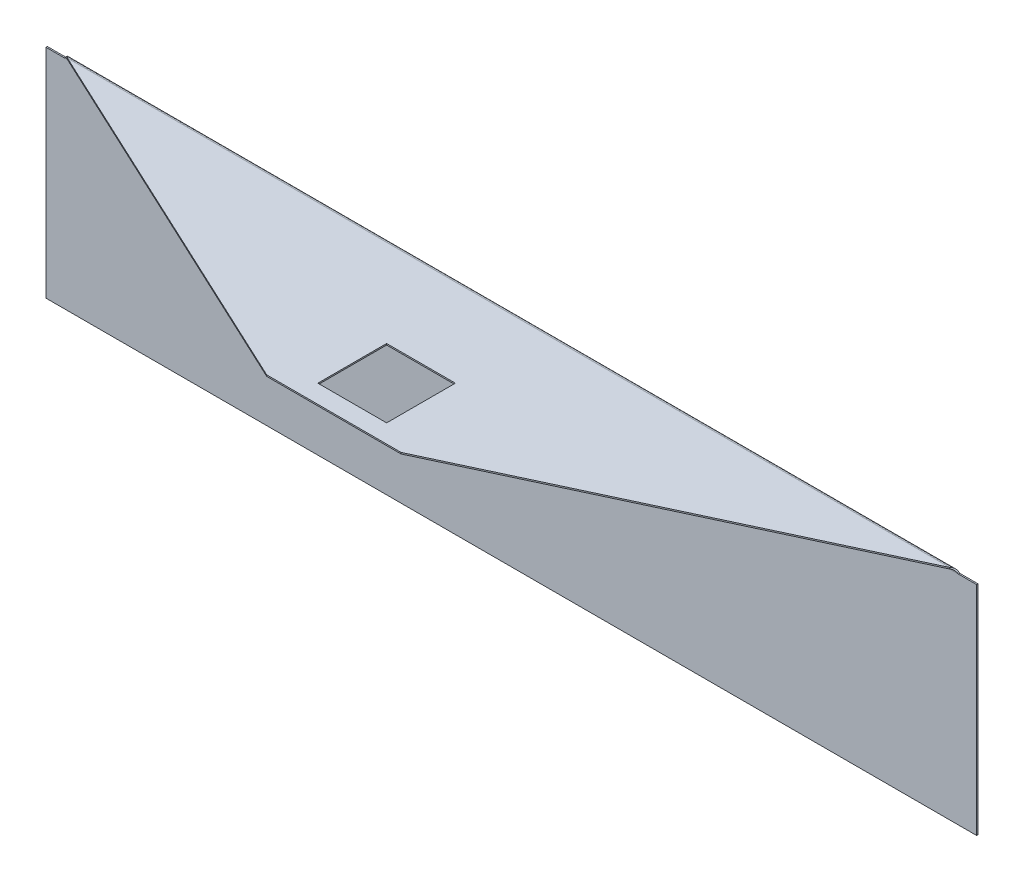
ISO-10303-21;
HEADER;
FILE_DESCRIPTION(('STEP AP214'),'2;1');
FILE_NAME('part.step','',(''),(''),'','','');
FILE_SCHEMA(('AUTOMOTIVE_DESIGN { 1 0 10303 214 1 1 1 1 }'));
ENDSEC;
DATA;
#1=APPLICATION_CONTEXT('core data for automotive mechanical design processes');
#2=APPLICATION_PROTOCOL_DEFINITION('international standard','automotive_design',2000,#1);
#3=PRODUCT_CONTEXT('',#1,'mechanical');
#4=PRODUCT('Part','Part','',(#3));
#5=PRODUCT_RELATED_PRODUCT_CATEGORY('part','',(#4));
#6=PRODUCT_DEFINITION_FORMATION('','',#4);
#7=PRODUCT_DEFINITION_CONTEXT('part definition',#1,'design');
#8=PRODUCT_DEFINITION('design','',#6,#7);
#9=PRODUCT_DEFINITION_SHAPE('','',#8);
#10=(LENGTH_UNIT() NAMED_UNIT(*) SI_UNIT(.MILLI.,.METRE.));
#11=(NAMED_UNIT(*) PLANE_ANGLE_UNIT() SI_UNIT($,.RADIAN.));
#12=(NAMED_UNIT(*) SI_UNIT($,.STERADIAN.) SOLID_ANGLE_UNIT());
#13=UNCERTAINTY_MEASURE_WITH_UNIT(LENGTH_MEASURE(1.E-05),#10,'distance_accuracy_value','');
#14=(GEOMETRIC_REPRESENTATION_CONTEXT(3) GLOBAL_UNCERTAINTY_ASSIGNED_CONTEXT((#13)) GLOBAL_UNIT_ASSIGNED_CONTEXT((#10,
#11,#12)) REPRESENTATION_CONTEXT('',''));
#15=CARTESIAN_POINT('',(0.,0.,0.));
#16=DIRECTION('',(0.,0.,1.));
#17=DIRECTION('',(1.,0.,0.));
#18=AXIS2_PLACEMENT_3D('',#15,#16,#17);
#19=CARTESIAN_POINT('',(507.5,241.5,0.));
#20=DIRECTION('',(0.,-1.,0.));
#21=DIRECTION('',(0.,0.,-1.));
#22=AXIS2_PLACEMENT_3D('',#19,#20,#21);
#23=PLANE('',#22);
#24=DIRECTION('',(-1.,0.,0.));
#25=VECTOR('',#24,1.);
#26=CARTESIAN_POINT('',(37.5,241.5,98.5));
#27=LINE('',#26,#25);
#28=CARTESIAN_POINT('',(37.5,241.5,98.5));
#29=VERTEX_POINT('',#28);
#30=CARTESIAN_POINT('',(-37.5,241.5,98.5));
#31=VERTEX_POINT('',#30);
#32=EDGE_CURVE('E160',#29,#31,#27,.T.);
#33=ORIENTED_EDGE('',*,*,#32,.F.);
#34=DIRECTION('',(0.,0.,-1.));
#35=VECTOR('',#34,1.);
#36=CARTESIAN_POINT('',(37.5,241.5,173.5));
#37=LINE('',#36,#35);
#38=CARTESIAN_POINT('',(37.5,241.5,173.5));
#39=VERTEX_POINT('',#38);
#40=EDGE_CURVE('E143',#39,#29,#37,.T.);
#41=ORIENTED_EDGE('',*,*,#40,.F.);
#42=DIRECTION('',(1.,0.,0.));
#43=VECTOR('',#42,1.);
#44=CARTESIAN_POINT('',(37.5,241.5,173.5));
#45=LINE('',#44,#43);
#46=CARTESIAN_POINT('',(-37.5,241.5,173.5));
#47=VERTEX_POINT('',#46);
#48=EDGE_CURVE('E152',#47,#39,#45,.T.);
#49=ORIENTED_EDGE('',*,*,#48,.F.);
#50=DIRECTION('',(0.,0.,1.));
#51=VECTOR('',#50,1.);
#52=CARTESIAN_POINT('',(-37.5,241.5,173.5));
#53=LINE('',#52,#51);
#54=EDGE_CURVE('E55',#31,#47,#53,.T.);
#55=ORIENTED_EDGE('',*,*,#54,.F.);
#56=EDGE_LOOP('',(#33,#41,#49,#55));
#57=FACE_BOUND('',#56,.T.);
#58=DIRECTION('',(-0.906034195359543,0.,-0.423204485844829));
#59=VECTOR('',#58,1.);
#60=CARTESIAN_POINT('',(-503.923943507499,241.5,-7.65594310815242));
#61=LINE('',#60,#59);
#62=CARTESIAN_POINT('',(-73.2712232463776,241.5,193.5));
#63=VERTEX_POINT('',#62);
#64=CARTESIAN_POINT('',(-481.110742885302,241.5,3.));
#65=VERTEX_POINT('',#64);
#66=EDGE_CURVE('E183',#63,#65,#61,.T.);
#67=ORIENTED_EDGE('',*,*,#66,.F.);
#68=DIRECTION('',(-1.,0.,0.));
#69=VECTOR('',#68,1.);
#70=CARTESIAN_POINT('',(507.5,241.5,193.5));
#71=LINE('',#70,#69);
#72=CARTESIAN_POINT('',(73.2712232463776,241.5,193.5));
#73=VERTEX_POINT('',#72);
#74=EDGE_CURVE('E296',#73,#63,#71,.T.);
#75=ORIENTED_EDGE('',*,*,#74,.F.);
#76=DIRECTION('',(0.906034195359543,0.,-0.423204485844829));
#77=VECTOR('',#76,1.);
#78=CARTESIAN_POINT('',(503.923943507499,241.5,-7.65594310815242));
#79=LINE('',#78,#77);
#80=CARTESIAN_POINT('',(481.110742885302,241.5,3.));
#81=VERTEX_POINT('',#80);
#82=EDGE_CURVE('E330',#73,#81,#79,.T.);
#83=ORIENTED_EDGE('',*,*,#82,.T.);
#84=DIRECTION('',(-1.,0.,0.));
#85=VECTOR('',#84,1.);
#86=CARTESIAN_POINT('',(507.5,241.5,3.));
#87=LINE('',#86,#85);
#88=EDGE_CURVE('E267',#81,#65,#87,.T.);
#89=ORIENTED_EDGE('',*,*,#88,.T.);
#90=EDGE_LOOP('',(#67,#75,#83,#89));
#91=FACE_BOUND('',#90,.T.);
#92=ADVANCED_FACE('F40',(#57,#91),#23,.F.);
#93=CARTESIAN_POINT('',(507.5,240.,193.5));
#94=DIRECTION('',(0.,0.,1.));
#95=DIRECTION('',(1.,0.,0.));
#96=AXIS2_PLACEMENT_3D('',#93,#94,#95);
#97=PLANE('',#96);
#98=ORIENTED_EDGE('',*,*,#74,.T.);
#99=DIRECTION('',(0.,-1.,0.));
#100=VECTOR('',#99,1.);
#101=CARTESIAN_POINT('',(-73.2712232463776,241.5,193.5));
#102=LINE('',#101,#100);
#103=CARTESIAN_POINT('',(-73.2712232463776,240.,193.5));
#104=VERTEX_POINT('',#103);
#105=EDGE_CURVE('E155',#104,#63,#102,.F.);
#106=ORIENTED_EDGE('',*,*,#105,.F.);
#107=DIRECTION('',(-1.,0.,0.));
#108=VECTOR('',#107,1.);
#109=CARTESIAN_POINT('',(507.5,240.,193.5));
#110=LINE('',#109,#108);
#111=CARTESIAN_POINT('',(73.2712232463776,240.,193.5));
#112=VERTEX_POINT('',#111);
#113=EDGE_CURVE('E292',#112,#104,#110,.T.);
#114=ORIENTED_EDGE('',*,*,#113,.F.);
#115=DIRECTION('',(0.,-1.,0.));
#116=VECTOR('',#115,1.);
#117=CARTESIAN_POINT('',(73.2712232463776,241.5,193.5));
#118=LINE('',#117,#116);
#119=EDGE_CURVE('E256',#112,#73,#118,.F.);
#120=ORIENTED_EDGE('',*,*,#119,.T.);
#121=EDGE_LOOP('',(#98,#106,#114,#120));
#122=FACE_BOUND('',#121,.T.);
#123=ADVANCED_FACE('F337',(#122),#97,.T.);
#124=CARTESIAN_POINT('',(507.5,240.,0.));
#125=DIRECTION('',(0.,-1.,0.));
#126=DIRECTION('',(0.,0.,-1.));
#127=AXIS2_PLACEMENT_3D('',#124,#125,#126);
#128=PLANE('',#127);
#129=DIRECTION('',(0.,0.,1.));
#130=VECTOR('',#129,1.);
#131=CARTESIAN_POINT('',(37.5,240.,173.5));
#132=LINE('',#131,#130);
#133=CARTESIAN_POINT('',(37.5,240.,98.5));
#134=VERTEX_POINT('',#133);
#135=CARTESIAN_POINT('',(37.5,240.,173.5));
#136=VERTEX_POINT('',#135);
#137=EDGE_CURVE('E63',#134,#136,#132,.T.);
#138=ORIENTED_EDGE('',*,*,#137,.F.);
#139=DIRECTION('',(1.,0.,0.));
#140=VECTOR('',#139,1.);
#141=CARTESIAN_POINT('',(37.5,240.,98.5));
#142=LINE('',#141,#140);
#143=CARTESIAN_POINT('',(-37.5,240.,98.5));
#144=VERTEX_POINT('',#143);
#145=EDGE_CURVE('E149',#144,#134,#142,.T.);
#146=ORIENTED_EDGE('',*,*,#145,.F.);
#147=DIRECTION('',(0.,0.,-1.));
#148=VECTOR('',#147,1.);
#149=CARTESIAN_POINT('',(-37.5,240.,173.5));
#150=LINE('',#149,#148);
#151=CARTESIAN_POINT('',(-37.5,240.,173.5));
#152=VERTEX_POINT('',#151);
#153=EDGE_CURVE('E168',#152,#144,#150,.T.);
#154=ORIENTED_EDGE('',*,*,#153,.F.);
#155=DIRECTION('',(-1.,0.,0.));
#156=VECTOR('',#155,1.);
#157=CARTESIAN_POINT('',(37.5,240.,173.5));
#158=LINE('',#157,#156);
#159=EDGE_CURVE('E162',#136,#152,#158,.T.);
#160=ORIENTED_EDGE('',*,*,#159,.F.);
#161=EDGE_LOOP('',(#138,#146,#154,#160));
#162=FACE_BOUND('',#161,.T.);
#163=ORIENTED_EDGE('',*,*,#113,.T.);
#164=DIRECTION('',(-0.906034195359543,0.,-0.423204485844829));
#165=VECTOR('',#164,1.);
#166=CARTESIAN_POINT('',(-503.923943507499,240.,-7.65594310815242));
#167=LINE('',#166,#165);
#168=CARTESIAN_POINT('',(-481.110742885302,240.,2.99999999999997));
#169=VERTEX_POINT('',#168);
#170=EDGE_CURVE('E178',#104,#169,#167,.T.);
#171=ORIENTED_EDGE('',*,*,#170,.T.);
#172=DIRECTION('',(-1.,0.,0.));
#173=VECTOR('',#172,1.);
#174=CARTESIAN_POINT('',(507.5,240.,3.));
#175=LINE('',#174,#173);
#176=CARTESIAN_POINT('',(481.110742885302,240.,2.99999999999997));
#177=VERTEX_POINT('',#176);
#178=EDGE_CURVE('E289',#177,#169,#175,.T.);
#179=ORIENTED_EDGE('',*,*,#178,.F.);
#180=DIRECTION('',(0.906034195359543,0.,-0.423204485844829));
#181=VECTOR('',#180,1.);
#182=CARTESIAN_POINT('',(503.923943507499,240.,-7.65594310815242));
#183=LINE('',#182,#181);
#184=EDGE_CURVE('E327',#112,#177,#183,.T.);
#185=ORIENTED_EDGE('',*,*,#184,.F.);
#186=EDGE_LOOP('',(#163,#171,#179,#185));
#187=FACE_BOUND('',#186,.T.);
#188=ADVANCED_FACE('F357',(#162,#187),#128,.T.);
#189=CARTESIAN_POINT('',(507.5,237.,3.));
#190=DIRECTION('',(-1.,0.,0.));
#191=DIRECTION('',(0.,0.,1.));
#192=AXIS2_PLACEMENT_3D('',#189,#190,#191);
#193=CYLINDRICAL_SURFACE('',#192,3.);
#194=ORIENTED_EDGE('',*,*,#178,.T.);
#195=CARTESIAN_POINT('',(-487.533412485915,237.,0.));
#196=CARTESIAN_POINT('',(-487.403451332048,237.095349117325,-1.48598657634483E-05));
#197=CARTESIAN_POINT('',(-487.27349213495,237.190698469654,0.00454510566328577));
#198=CARTESIAN_POINT('',(-487.013592538698,237.380523543049,0.0227080038034484));
#199=CARTESIAN_POINT('',(-486.883652139238,237.474999372649,0.0363097972438175));
#200=CARTESIAN_POINT('',(-486.623777821424,237.662223764344,0.0724489467742617));
#201=CARTESIAN_POINT('',(-486.49384390303,237.754972399899,0.0949859219291862));
#202=CARTESIAN_POINT('',(-486.234372549697,237.937615423378,0.148700452649654));
#203=CARTESIAN_POINT('',(-486.10483512781,238.027517731664,0.179851146312812));
#204=CARTESIAN_POINT('',(-485.845765499757,238.203957974717,0.250542388969023));
#205=CARTESIAN_POINT('',(-485.716233293574,238.290496033564,0.290082628191677));
#206=CARTESIAN_POINT('',(-485.457175049675,238.459429926774,0.377196939170626));
#207=CARTESIAN_POINT('',(-485.327649011887,238.541825880059,0.42477078010638));
#208=CARTESIAN_POINT('',(-485.068347121147,238.701888971311,0.527624441817014));
#209=CARTESIAN_POINT('',(-484.93857127189,238.779546608275,0.582919058461141));
#210=CARTESIAN_POINT('',(-484.679008034836,238.929251651493,0.700639966775583));
#211=CARTESIAN_POINT('',(-484.54922064679,239.001298768227,0.763066626072952));
#212=CARTESIAN_POINT('',(-484.289640118908,239.139135242221,0.894490949999997));
#213=CARTESIAN_POINT('',(-484.159846979105,239.204924290311,0.963488938939827));
#214=CARTESIAN_POINT('',(-483.900348936281,239.329603212219,1.10738134409735));
#215=CARTESIAN_POINT('',(-483.77064403243,239.388497680802,1.18227177710861));
#216=CARTESIAN_POINT('',(-483.511245814195,239.49890252681,1.33730882134258));
#217=CARTESIAN_POINT('',(-483.381552499569,239.550413322122,1.41745513472721));
#218=CARTESIAN_POINT('',(-483.122182520375,239.645574506633,1.58225979815205));
#219=CARTESIAN_POINT('',(-482.992505857618,239.689226455846,1.66691724837761));
#220=CARTESIAN_POINT('',(-482.76554905599,239.758417332932,1.81837793251847));
#221=CARTESIAN_POINT('',(-482.668265385925,239.785757318976,1.88436056522504));
#222=CARTESIAN_POINT('',(-482.473708780352,239.835658918839,2.01809814043252));
#223=CARTESIAN_POINT('',(-482.376435845307,239.858221217743,2.0858528272658));
#224=CARTESIAN_POINT('',(-482.181899644516,239.898456300248,2.22279742951416));
#225=CARTESIAN_POINT('',(-482.084636378552,239.916129400171,2.29198725176654));
#226=CARTESIAN_POINT('',(-481.889982958145,239.946517280017,2.43154343283732));
#227=CARTESIAN_POINT('',(-481.792592804402,239.959225533808,2.50191121426224));
#228=CARTESIAN_POINT('',(-481.597802061669,239.979584839993,2.6433775223538));
#229=CARTESIAN_POINT('',(-481.500401472493,239.987235464082,2.71447611039111));
#230=CARTESIAN_POINT('',(-481.305581517872,239.997445789566,2.85704950872596));
#231=CARTESIAN_POINT('',(-481.208162152244,240.000004561375,2.92852438533244));
#232=CARTESIAN_POINT('',(-481.110742885302,240.,2.99999999999998));
#233=B_SPLINE_CURVE_WITH_KNOTS('',3,(#195,#196,#197,#198,#199,#200,#201,#202,#203,#204,#205,
#206,#207,#208,#209,#210,#211,#212,#213,#214,#215,#216,#217,#218,#219,#220,#221,#222,#223,#224,
#225,#226,#227,#228,#229,#230,#231,#232),.UNSPECIFIED.,.F.,.F.,(4,2,2,2,2,2,2,2,2,2,2,2,2,2,2,2,
2,2,4),(0.,0.483495476622525,0.966930049681638,1.45034401460672,1.93226713075571,
2.41417245576878,2.89606393708733,3.37889190997741,3.86174478187414,4.34462149602549,
4.82717455159902,5.30970028564311,5.79213013028426,6.15408935439192,6.51599664089968,
6.87788050705167,7.24023847025828,7.60262711579612,7.96508191422729),.UNSPECIFIED.);
#234=CARTESIAN_POINT('',(-487.533412485915,237.,0.));
#235=VERTEX_POINT('',#234);
#236=EDGE_CURVE('E195',#235,#169,#233,.T.);
#237=ORIENTED_EDGE('',*,*,#236,.F.);
#238=DIRECTION('',(-1.,0.,0.));
#239=VECTOR('',#238,1.);
#240=CARTESIAN_POINT('',(507.5,237.,0.));
#241=LINE('',#240,#239);
#242=CARTESIAN_POINT('',(487.533412485915,237.,0.));
#243=VERTEX_POINT('',#242);
#244=EDGE_CURVE('E286',#243,#235,#241,.T.);
#245=ORIENTED_EDGE('',*,*,#244,.F.);
#246=CARTESIAN_POINT('',(487.533412485915,237.,0.));
#247=CARTESIAN_POINT('',(487.403451332048,237.095349117325,-1.48598657634483E-05));
#248=CARTESIAN_POINT('',(487.27349213495,237.190698469654,0.00454510566328577));
#249=CARTESIAN_POINT('',(487.013592538698,237.380523543049,0.0227080038034484));
#250=CARTESIAN_POINT('',(486.883652139238,237.474999372649,0.0363097972438175));
#251=CARTESIAN_POINT('',(486.623777821424,237.662223764344,0.0724489467742617));
#252=CARTESIAN_POINT('',(486.49384390303,237.754972399899,0.0949859219291862));
#253=CARTESIAN_POINT('',(486.234372549697,237.937615423378,0.148700452649654));
#254=CARTESIAN_POINT('',(486.10483512781,238.027517731664,0.179851146312812));
#255=CARTESIAN_POINT('',(485.845765499757,238.203957974717,0.250542388969023));
#256=CARTESIAN_POINT('',(485.716233293574,238.290496033564,0.290082628191677));
#257=CARTESIAN_POINT('',(485.457175049675,238.459429926774,0.377196939170626));
#258=CARTESIAN_POINT('',(485.327649011887,238.541825880059,0.42477078010638));
#259=CARTESIAN_POINT('',(485.068347121147,238.701888971311,0.527624441817014));
#260=CARTESIAN_POINT('',(484.93857127189,238.779546608275,0.582919058461141));
#261=CARTESIAN_POINT('',(484.679008034836,238.929251651493,0.700639966775583));
#262=CARTESIAN_POINT('',(484.54922064679,239.001298768227,0.763066626072952));
#263=CARTESIAN_POINT('',(484.289640118908,239.139135242221,0.894490949999997));
#264=CARTESIAN_POINT('',(484.159846979105,239.204924290311,0.963488938939827));
#265=CARTESIAN_POINT('',(483.900348936281,239.329603212219,1.10738134409735));
#266=CARTESIAN_POINT('',(483.77064403243,239.388497680802,1.18227177710861));
#267=CARTESIAN_POINT('',(483.511245814195,239.49890252681,1.33730882134258));
#268=CARTESIAN_POINT('',(483.381552499569,239.550413322122,1.41745513472721));
#269=CARTESIAN_POINT('',(483.122182520375,239.645574506633,1.58225979815205));
#270=CARTESIAN_POINT('',(482.992505857618,239.689226455846,1.66691724837761));
#271=CARTESIAN_POINT('',(482.76554905599,239.758417332932,1.81837793251847));
#272=CARTESIAN_POINT('',(482.668265385925,239.785757318976,1.88436056522504));
#273=CARTESIAN_POINT('',(482.473708780352,239.835658918839,2.01809814043252));
#274=CARTESIAN_POINT('',(482.376435845307,239.858221217743,2.0858528272658));
#275=CARTESIAN_POINT('',(482.181899644516,239.898456300248,2.22279742951416));
#276=CARTESIAN_POINT('',(482.084636378552,239.916129400171,2.29198725176654));
#277=CARTESIAN_POINT('',(481.889982958145,239.946517280017,2.43154343283732));
#278=CARTESIAN_POINT('',(481.792592804402,239.959225533808,2.50191121426224));
#279=CARTESIAN_POINT('',(481.597802061669,239.979584839993,2.6433775223538));
#280=CARTESIAN_POINT('',(481.500401472493,239.987235464082,2.71447611039111));
#281=CARTESIAN_POINT('',(481.305581517872,239.997445789566,2.85704950872596));
#282=CARTESIAN_POINT('',(481.208162152244,240.000004561375,2.92852438533244));
#283=CARTESIAN_POINT('',(481.110742885302,240.,2.99999999999998));
#284=B_SPLINE_CURVE_WITH_KNOTS('',3,(#246,#247,#248,#249,#250,#251,#252,#253,#254,#255,#256,
#257,#258,#259,#260,#261,#262,#263,#264,#265,#266,#267,#268,#269,#270,#271,#272,#273,#274,#275,
#276,#277,#278,#279,#280,#281,#282,#283),.UNSPECIFIED.,.F.,.F.,(4,2,2,2,2,2,2,2,2,2,2,2,2,2,2,2,
2,2,4),(0.,0.483495476622525,0.966930049681638,1.45034401460672,1.93226713075571,
2.41417245576878,2.89606393708733,3.37889190997741,3.86174478187414,4.34462149602549,
4.82717455159902,5.30970028564311,5.79213013028426,6.15408935439192,6.51599664089968,
6.87788050705167,7.24023847025828,7.60262711579612,7.96508191422729),.UNSPECIFIED.);
#285=EDGE_CURVE('E237',#243,#177,#284,.T.);
#286=ORIENTED_EDGE('',*,*,#285,.T.);
#287=EDGE_LOOP('',(#194,#237,#245,#286));
#288=FACE_BOUND('',#287,.T.);
#289=ADVANCED_FACE('F362',(#288),#193,.F.);
#290=CARTESIAN_POINT('',(507.5,237.,3.));
#291=DIRECTION('',(-1.,0.,0.));
#292=DIRECTION('',(0.,0.,1.));
#293=AXIS2_PLACEMENT_3D('',#290,#291,#292);
#294=CYLINDRICAL_SURFACE('',#293,4.5);
#295=CARTESIAN_POINT('',(-487.533412485915,237.,-1.5));
#296=CARTESIAN_POINT('',(-487.455632572347,237.08560060997,-1.5000006946751));
#297=CARTESIAN_POINT('',(-487.377861205753,237.171189904338,-1.49755697149426));
#298=CARTESIAN_POINT('',(-487.222319313664,237.342090000806,-1.48779464872566));
#299=CARTESIAN_POINT('',(-487.144548788167,237.427400804297,-1.4804760735648));
#300=CARTESIAN_POINT('',(-486.911260497063,237.682480963738,-1.45123493481991));
#301=CARTESIAN_POINT('',(-486.755718464926,237.851450736628,-1.42202694042859));
#302=CARTESIAN_POINT('',(-486.444853857012,238.184716491681,-1.34461569149599));
#303=CARTESIAN_POINT('',(-486.28953126288,238.349018355717,-1.29643759263802));
#304=CARTESIAN_POINT('',(-485.978881091218,238.671077089422,-1.18171217618004));
#305=CARTESIAN_POINT('',(-485.823553513898,238.828834116985,-1.11516530202394));
#306=CARTESIAN_POINT('',(-485.512783294734,239.135879548551,-0.964503352717799));
#307=CARTESIAN_POINT('',(-485.357340657618,239.28516125258,-0.880374617927147));
#308=CARTESIAN_POINT('',(-485.046458831038,239.573183563482,-0.695672217214591));
#309=CARTESIAN_POINT('',(-484.891019641576,239.711924166673,-0.595098545547072));
#310=CARTESIAN_POINT('',(-484.58015522258,239.977033548214,-0.378835790142991));
#311=CARTESIAN_POINT('',(-484.424729994219,240.103404088682,-0.263148864788806));
#312=CARTESIAN_POINT('',(-484.113884433503,240.342157701914,-0.0181514149007465));
#313=CARTESIAN_POINT('',(-483.958464101145,240.45454120717,0.111158688164264));
#314=CARTESIAN_POINT('',(-483.647271101123,240.664113661073,0.382049776101594));
#315=CARTESIAN_POINT('',(-483.49149845617,240.761266600847,0.523658646729984));
#316=CARTESIAN_POINT('',(-483.17992822748,240.938793554432,0.817041662779608));
#317=CARTESIAN_POINT('',(-483.024130642836,241.019165817603,0.968816866621181));
#318=CARTESIAN_POINT('',(-482.712631667783,241.16202946031,1.28044402805796));
#319=CARTESIAN_POINT('',(-482.556930277688,241.224531907161,1.44029091411617));
#320=CARTESIAN_POINT('',(-482.245590562846,241.330891211766,1.76601345826219));
#321=CARTESIAN_POINT('',(-482.089952237501,241.374755431077,1.93188670795903));
#322=CARTESIAN_POINT('',(-481.796926559493,241.439274740238,2.24787218855407));
#323=CARTESIAN_POINT('',(-481.659537161647,241.462046822026,2.39755428593317));
#324=CARTESIAN_POINT('',(-481.385016571301,241.492408039919,2.69815705865799));
#325=CARTESIAN_POINT('',(-481.247885386721,241.50002608567,2.84907482306855));
#326=CARTESIAN_POINT('',(-481.110742885302,241.5,2.99999999999997));
#327=B_SPLINE_CURVE_WITH_KNOTS('',3,(#295,#296,#297,#298,#299,#300,#301,#302,#303,#304,#305,
#306,#307,#308,#309,#310,#311,#312,#313,#314,#315,#316,#317,#318,#319,#320,#321,#322,#323,#324,
#325,#326),.UNSPECIFIED.,.F.,.F.,(4,2,2,2,2,2,2,2,2,2,2,2,2,2,2,4),(0.,0.346925310758013,
0.693848883156942,1.38748383917001,2.08020206787584,2.77290357500852,3.46614526758696,
4.15938720237422,4.85253024060253,5.54565184092013,6.24038821337677,6.93519702782787,
7.6295745894339,8.32367763658529,8.93646434646724,9.54808090589033),.UNSPECIFIED.);
#328=CARTESIAN_POINT('',(-487.533412485915,237.,-1.5));
#329=VERTEX_POINT('',#328);
#330=EDGE_CURVE('E186',#329,#65,#327,.T.);
#331=ORIENTED_EDGE('',*,*,#330,.T.);
#332=ORIENTED_EDGE('',*,*,#88,.F.);
#333=CARTESIAN_POINT('',(487.533412485915,237.,-1.5));
#334=CARTESIAN_POINT('',(487.455632572347,237.08560060997,-1.5000006946751));
#335=CARTESIAN_POINT('',(487.377861205753,237.171189904338,-1.49755697149426));
#336=CARTESIAN_POINT('',(487.222319313664,237.342090000806,-1.48779464872566));
#337=CARTESIAN_POINT('',(487.144548788167,237.427400804297,-1.4804760735648));
#338=CARTESIAN_POINT('',(486.911260497063,237.682480963738,-1.45123493481991));
#339=CARTESIAN_POINT('',(486.755718464926,237.851450736628,-1.42202694042859));
#340=CARTESIAN_POINT('',(486.444853857012,238.184716491681,-1.34461569149599));
#341=CARTESIAN_POINT('',(486.28953126288,238.349018355717,-1.29643759263802));
#342=CARTESIAN_POINT('',(485.978881091218,238.671077089422,-1.18171217618004));
#343=CARTESIAN_POINT('',(485.823553513898,238.828834116985,-1.11516530202394));
#344=CARTESIAN_POINT('',(485.512783294734,239.135879548551,-0.964503352717799));
#345=CARTESIAN_POINT('',(485.357340657618,239.28516125258,-0.880374617927147));
#346=CARTESIAN_POINT('',(485.046458831038,239.573183563482,-0.695672217214591));
#347=CARTESIAN_POINT('',(484.891019641576,239.711924166673,-0.595098545547072));
#348=CARTESIAN_POINT('',(484.58015522258,239.977033548214,-0.378835790142991));
#349=CARTESIAN_POINT('',(484.424729994219,240.103404088682,-0.263148864788806));
#350=CARTESIAN_POINT('',(484.113884433503,240.342157701914,-0.0181514149007465));
#351=CARTESIAN_POINT('',(483.958464101145,240.45454120717,0.111158688164264));
#352=CARTESIAN_POINT('',(483.647271101123,240.664113661073,0.382049776101594));
#353=CARTESIAN_POINT('',(483.49149845617,240.761266600847,0.523658646729984));
#354=CARTESIAN_POINT('',(483.17992822748,240.938793554432,0.817041662779608));
#355=CARTESIAN_POINT('',(483.024130642836,241.019165817603,0.968816866621181));
#356=CARTESIAN_POINT('',(482.712631667783,241.16202946031,1.28044402805796));
#357=CARTESIAN_POINT('',(482.556930277688,241.224531907161,1.44029091411617));
#358=CARTESIAN_POINT('',(482.245590562846,241.330891211766,1.76601345826219));
#359=CARTESIAN_POINT('',(482.089952237501,241.374755431077,1.93188670795903));
#360=CARTESIAN_POINT('',(481.796926559493,241.439274740238,2.24787218855407));
#361=CARTESIAN_POINT('',(481.659537161647,241.462046822026,2.39755428593317));
#362=CARTESIAN_POINT('',(481.385016571301,241.492408039919,2.69815705865799));
#363=CARTESIAN_POINT('',(481.247885386721,241.50002608567,2.84907482306855));
#364=CARTESIAN_POINT('',(481.110742885302,241.5,2.99999999999997));
#365=B_SPLINE_CURVE_WITH_KNOTS('',3,(#333,#334,#335,#336,#337,#338,#339,#340,#341,#342,#343,
#344,#345,#346,#347,#348,#349,#350,#351,#352,#353,#354,#355,#356,#357,#358,#359,#360,#361,#362,
#363,#364),.UNSPECIFIED.,.F.,.F.,(4,2,2,2,2,2,2,2,2,2,2,2,2,2,2,4),(0.,0.346925310758013,
0.693848883156942,1.38748383917001,2.08020206787584,2.77290357500852,3.46614526758696,
4.15938720237422,4.85253024060253,5.54565184092013,6.24038821337677,6.93519702782787,
7.6295745894339,8.32367763658529,8.93646434646724,9.54808090589033),.UNSPECIFIED.);
#366=CARTESIAN_POINT('',(487.533412485915,237.,-1.5));
#367=VERTEX_POINT('',#366);
#368=EDGE_CURVE('E244',#367,#81,#365,.T.);
#369=ORIENTED_EDGE('',*,*,#368,.F.);
#370=DIRECTION('',(-1.,0.,0.));
#371=VECTOR('',#370,1.);
#372=CARTESIAN_POINT('',(507.5,237.,-1.5));
#373=LINE('',#372,#371);
#374=EDGE_CURVE('E278',#367,#329,#373,.T.);
#375=ORIENTED_EDGE('',*,*,#374,.T.);
#376=EDGE_LOOP('',(#331,#332,#369,#375));
#377=FACE_BOUND('',#376,.T.);
#378=ADVANCED_FACE('F346',(#377),#294,.T.);
#379=CARTESIAN_POINT('',(-507.5,241.5,3.));
#380=DIRECTION('',(-1.,0.,0.));
#381=DIRECTION('',(0.,0.,1.));
#382=AXIS2_PLACEMENT_3D('',#379,#380,#381);
#383=PLANE('',#382);
#384=DIRECTION('',(0.,1.,0.));
#385=VECTOR('',#384,1.);
#386=CARTESIAN_POINT('',(-507.5,240.,0.));
#387=LINE('',#386,#385);
#388=CARTESIAN_POINT('',(-507.5,0.,0.));
#389=VERTEX_POINT('',#388);
#390=CARTESIAN_POINT('',(-507.5,237.,0.));
#391=VERTEX_POINT('',#390);
#392=EDGE_CURVE('E268',#389,#391,#387,.T.);
#393=ORIENTED_EDGE('',*,*,#392,.T.);
#394=DIRECTION('',(0.,0.,-1.));
#395=VECTOR('',#394,1.);
#396=CARTESIAN_POINT('',(-507.5,237.,0.));
#397=LINE('',#396,#395);
#398=CARTESIAN_POINT('',(-507.5,237.,-1.5));
#399=VERTEX_POINT('',#398);
#400=EDGE_CURVE('E48',#391,#399,#397,.T.);
#401=ORIENTED_EDGE('',*,*,#400,.T.);
#402=DIRECTION('',(0.,1.,0.));
#403=VECTOR('',#402,1.);
#404=CARTESIAN_POINT('',(-507.5,240.,-1.5));
#405=LINE('',#404,#403);
#406=CARTESIAN_POINT('',(-507.5,0.,-1.5));
#407=VERTEX_POINT('',#406);
#408=EDGE_CURVE('E261',#407,#399,#405,.T.);
#409=ORIENTED_EDGE('',*,*,#408,.F.);
#410=DIRECTION('',(0.,0.,1.));
#411=VECTOR('',#410,1.);
#412=CARTESIAN_POINT('',(-507.5,0.,-1.5));
#413=LINE('',#412,#411);
#414=EDGE_CURVE('E271',#407,#389,#413,.T.);
#415=ORIENTED_EDGE('',*,*,#414,.T.);
#416=EDGE_LOOP('',(#393,#401,#409,#415));
#417=FACE_BOUND('',#416,.T.);
#418=ADVANCED_FACE('F42',(#417),#383,.T.);
#419=CARTESIAN_POINT('',(507.5,240.,0.));
#420=DIRECTION('',(0.,0.,1.));
#421=DIRECTION('',(1.,0.,0.));
#422=AXIS2_PLACEMENT_3D('',#419,#420,#421);
#423=PLANE('',#422);
#424=ORIENTED_EDGE('',*,*,#392,.F.);
#425=DIRECTION('',(-1.,0.,0.));
#426=VECTOR('',#425,1.);
#427=CARTESIAN_POINT('',(507.5,0.,0.));
#428=LINE('',#427,#426);
#429=CARTESIAN_POINT('',(507.5,0.,0.));
#430=VERTEX_POINT('',#429);
#431=EDGE_CURVE('E283',#430,#389,#428,.T.);
#432=ORIENTED_EDGE('',*,*,#431,.F.);
#433=DIRECTION('',(0.,1.,0.));
#434=VECTOR('',#433,1.);
#435=CARTESIAN_POINT('',(507.5,240.,0.));
#436=LINE('',#435,#434);
#437=CARTESIAN_POINT('',(507.5,237.,0.));
#438=VERTEX_POINT('',#437);
#439=EDGE_CURVE('E257',#430,#438,#436,.T.);
#440=ORIENTED_EDGE('',*,*,#439,.T.);
#441=EDGE_CURVE('E287',#438,#243,#241,.T.);
#442=ORIENTED_EDGE('',*,*,#441,.T.);
#443=ORIENTED_EDGE('',*,*,#244,.T.);
#444=DIRECTION('',(1.,0.,0.));
#445=VECTOR('',#444,1.);
#446=CARTESIAN_POINT('',(-507.5,237.,0.));
#447=LINE('',#446,#445);
#448=EDGE_CURVE('E321',#391,#235,#447,.T.);
#449=ORIENTED_EDGE('',*,*,#448,.F.);
#450=EDGE_LOOP('',(#424,#432,#440,#442,#443,#449));
#451=FACE_BOUND('',#450,.T.);
#452=ADVANCED_FACE('F319',(#451),#423,.T.);
#453=CARTESIAN_POINT('',(507.5,0.,-1.5));
#454=DIRECTION('',(0.,-1.,0.));
#455=DIRECTION('',(0.,0.,-1.));
#456=AXIS2_PLACEMENT_3D('',#453,#454,#455);
#457=PLANE('',#456);
#458=ORIENTED_EDGE('',*,*,#414,.F.);
#459=DIRECTION('',(-1.,0.,0.));
#460=VECTOR('',#459,1.);
#461=CARTESIAN_POINT('',(507.5,0.,-1.5));
#462=LINE('',#461,#460);
#463=CARTESIAN_POINT('',(507.5,0.,-1.5));
#464=VERTEX_POINT('',#463);
#465=EDGE_CURVE('E281',#464,#407,#462,.T.);
#466=ORIENTED_EDGE('',*,*,#465,.F.);
#467=DIRECTION('',(0.,0.,1.));
#468=VECTOR('',#467,1.);
#469=CARTESIAN_POINT('',(507.5,0.,-1.5));
#470=LINE('',#469,#468);
#471=EDGE_CURVE('E260',#464,#430,#470,.T.);
#472=ORIENTED_EDGE('',*,*,#471,.T.);
#473=ORIENTED_EDGE('',*,*,#431,.T.);
#474=EDGE_LOOP('',(#458,#466,#472,#473));
#475=FACE_BOUND('',#474,.T.);
#476=ADVANCED_FACE('F316',(#475),#457,.T.);
#477=CARTESIAN_POINT('',(507.5,240.,-1.5));
#478=DIRECTION('',(0.,0.,1.));
#479=DIRECTION('',(1.,0.,0.));
#480=AXIS2_PLACEMENT_3D('',#477,#478,#479);
#481=PLANE('',#480);
#482=ORIENTED_EDGE('',*,*,#408,.T.);
#483=DIRECTION('',(1.,0.,0.));
#484=VECTOR('',#483,1.);
#485=CARTESIAN_POINT('',(-507.5,237.,-1.5));
#486=LINE('',#485,#484);
#487=EDGE_CURVE('E310',#399,#329,#486,.T.);
#488=ORIENTED_EDGE('',*,*,#487,.T.);
#489=ORIENTED_EDGE('',*,*,#374,.F.);
#490=CARTESIAN_POINT('',(507.5,237.,-1.5));
#491=VERTEX_POINT('',#490);
#492=EDGE_CURVE('E279',#491,#367,#373,.T.);
#493=ORIENTED_EDGE('',*,*,#492,.F.);
#494=DIRECTION('',(0.,1.,0.));
#495=VECTOR('',#494,1.);
#496=CARTESIAN_POINT('',(507.5,240.,-1.5));
#497=LINE('',#496,#495);
#498=EDGE_CURVE('E264',#464,#491,#497,.T.);
#499=ORIENTED_EDGE('',*,*,#498,.F.);
#500=ORIENTED_EDGE('',*,*,#465,.T.);
#501=EDGE_LOOP('',(#482,#488,#489,#493,#499,#500));
#502=FACE_BOUND('',#501,.T.);
#503=ADVANCED_FACE('F308',(#502),#481,.F.);
#504=CARTESIAN_POINT('',(507.5,237.,3.));
#505=DIRECTION('',(-1.,0.,0.));
#506=DIRECTION('',(0.,0.,1.));
#507=AXIS2_PLACEMENT_3D('',#504,#505,#506);
#508=PLANE('',#507);
#509=ORIENTED_EDGE('',*,*,#498,.T.);
#510=DIRECTION('',(0.,0.,1.));
#511=VECTOR('',#510,1.);
#512=CARTESIAN_POINT('',(507.5,237.,-1.5));
#513=LINE('',#512,#511);
#514=EDGE_CURVE('E11',#491,#438,#513,.T.);
#515=ORIENTED_EDGE('',*,*,#514,.T.);
#516=ORIENTED_EDGE('',*,*,#439,.F.);
#517=ORIENTED_EDGE('',*,*,#471,.F.);
#518=EDGE_LOOP('',(#509,#515,#516,#517));
#519=FACE_BOUND('',#518,.T.);
#520=ADVANCED_FACE('F226',(#519),#508,.F.);
#521=CARTESIAN_POINT('',(487.533412485915,237.,-1.51515));
#522=CARTESIAN_POINT('',(486.998136967341,237.591090265201,-1.51515));
#523=CARTESIAN_POINT('',(486.46296755248,238.181830960065,-1.39763273105894));
#524=CARTESIAN_POINT('',(485.392522619044,239.273915239222,-0.945276611377729));
#525=CARTESIAN_POINT('',(484.857300152327,239.774770622695,-0.610615743454151));
#526=CARTESIAN_POINT('',(483.786855218891,240.610615743454,0.225229377305248));
#527=CARTESIAN_POINT('',(483.251632752173,240.945276611378,0.726084760778314));
#528=CARTESIAN_POINT('',(482.181187818738,241.397632731059,1.81816903993517));
#529=CARTESIAN_POINT('',(481.646018403877,241.51515,2.40890973479892));
#530=CARTESIAN_POINT('',(481.110742885302,241.51515,2.99999999999997));
#531=CARTESIAN_POINT('',(487.533412485915,237.,-1.5));
#532=CARTESIAN_POINT('',(486.998137160146,237.58910679752,-1.5));
#533=CARTESIAN_POINT('',(486.46296755248,238.177865479617,-1.38287704500742));
#534=CARTESIAN_POINT('',(485.392522619044,239.266285411669,-0.932038747594162));
#535=CARTESIAN_POINT('',(484.857300152327,239.765460239887,-0.598500790791819));
#536=CARTESIAN_POINT('',(483.786855218891,240.598500790792,0.234539760112868));
#537=CARTESIAN_POINT('',(483.251632752173,240.932038747594,0.733714588330933));
#538=CARTESIAN_POINT('',(482.181187818738,241.382877045007,1.82213452038321));
#539=CARTESIAN_POINT('',(481.646018211072,241.5,2.41089320248041));
#540=CARTESIAN_POINT('',(481.110742885302,241.5,2.99999999999997));
#541=CARTESIAN_POINT('',(487.533412485915,237.,0.));
#542=CARTESIAN_POINT('',(486.99815624973,237.392723858758,0.));
#543=CARTESIAN_POINT('',(486.46296755248,237.785243653078,0.0780819699950527));
#544=CARTESIAN_POINT('',(485.392522619044,238.510856941113,0.378640834937223));
#545=CARTESIAN_POINT('',(484.857300152327,238.843640159925,0.600999472805454));
#546=CARTESIAN_POINT('',(483.786855218891,239.399000527195,1.15635984007525));
#547=CARTESIAN_POINT('',(483.251632752173,239.621359165063,1.48914305888729));
#548=CARTESIAN_POINT('',(482.181187818738,239.921918030005,2.21475634692214));
#549=CARTESIAN_POINT('',(481.645999121488,240.,2.60727614124168));
#550=CARTESIAN_POINT('',(481.110742885302,240.,2.99999999999998));
#551=CARTESIAN_POINT('',(487.533412485915,237.,0.015));
#552=CARTESIAN_POINT('',(486.998156440626,237.39076002937,0.015));
#553=CARTESIAN_POINT('',(486.46296755248,237.781317434812,0.0926915601450775));
#554=CARTESIAN_POINT('',(485.392522619044,238.503302656407,0.391747630762537));
#555=CARTESIAN_POINT('',(484.857300152327,238.834421959125,0.612994475441427));
#556=CARTESIAN_POINT('',(483.786855218891,239.387005524559,1.16557804087487));
#557=CARTESIAN_POINT('',(483.251632752173,239.608252369237,1.49669734359285));
#558=CARTESIAN_POINT('',(482.181187818738,239.907308439855,2.21868256518753));
#559=CARTESIAN_POINT('',(481.645998930592,239.985,2.60923997062929));
#560=CARTESIAN_POINT('',(481.110742885302,239.985,2.99999999999998));
#561=B_SPLINE_SURFACE_WITH_KNOTS('',1,3,((#521,#522,#523,#524,#525,#526,#527,#528,#529,#530),
(#531,#532,#533,#534,#535,#536,#537,#538,#539,#540),(#541,#542,#543,#544,#545,#546,#547,#548,
#549,#550),(#551,#552,#553,#554,#555,#556,#557,#558,#559,#560)),.UNSPECIFIED.,.F.,.F.,.F.,(2,1,
1,2),(4,2,2,2,4),(-0.0101,0.,1.,1.01),(0.,0.25,0.5,0.75,1.),.UNSPECIFIED.);
#562=DIRECTION('',(0.,1.,0.));
#563=VECTOR('',#562,1.);
#564=CARTESIAN_POINT('',(481.110742885302,240.,2.99999999999995));
#565=LINE('',#564,#563);
#566=EDGE_CURVE('E254',#177,#81,#565,.T.);
#567=DIRECTION('',(0.,0.,-1.));
#568=VECTOR('',#567,1.);
#569=CARTESIAN_POINT('',(487.533412485915,237.,0.));
#570=LINE('',#569,#568);
#571=EDGE_CURVE('E251',#243,#367,#570,.T.);
#572=ORIENTED_EDGE('',*,*,#368,.T.);
#573=ORIENTED_EDGE('',*,*,#566,.F.);
#574=ORIENTED_EDGE('',*,*,#285,.F.);
#575=ORIENTED_EDGE('',*,*,#571,.T.);
#576=EDGE_LOOP('',(#572,#573,#574,#575));
#577=FACE_BOUND('',#576,.T.);
#578=ADVANCED_FACE('F219',(#577),#561,.F.);
#579=CARTESIAN_POINT('',(497.516706242958,237.,0.));
#580=DIRECTION('',(0.,-1.,0.));
#581=DIRECTION('',(-1.,0.,0.));
#582=AXIS2_PLACEMENT_3D('',#579,#580,#581);
#583=PLANE('',#582);
#584=ORIENTED_EDGE('',*,*,#571,.F.);
#585=ORIENTED_EDGE('',*,*,#441,.F.);
#586=ORIENTED_EDGE('',*,*,#514,.F.);
#587=ORIENTED_EDGE('',*,*,#492,.T.);
#588=EDGE_LOOP('',(#584,#585,#586,#587));
#589=FACE_BOUND('',#588,.T.);
#590=ADVANCED_FACE('F215',(#589),#583,.F.);
#591=CARTESIAN_POINT('',(503.923943507499,241.5,-7.65594310815242));
#592=DIRECTION('',(-0.423204485844829,0.,-0.906034195359543));
#593=DIRECTION('',(0.906034195359543,0.,-0.423204485844829));
#594=AXIS2_PLACEMENT_3D('',#591,#592,#593);
#595=PLANE('',#594);
#596=ORIENTED_EDGE('',*,*,#119,.F.);
#597=ORIENTED_EDGE('',*,*,#184,.T.);
#598=ORIENTED_EDGE('',*,*,#566,.T.);
#599=ORIENTED_EDGE('',*,*,#82,.F.);
#600=EDGE_LOOP('',(#596,#597,#598,#599));
#601=FACE_BOUND('',#600,.T.);
#602=ADVANCED_FACE('F212',(#601),#595,.F.);
#603=CARTESIAN_POINT('',(-497.516706242958,237.,0.));
#604=DIRECTION('',(0.,-1.,0.));
#605=DIRECTION('',(1.,0.,0.));
#606=AXIS2_PLACEMENT_3D('',#603,#604,#605);
#607=PLANE('',#606);
#608=DIRECTION('',(0.,0.,-1.));
#609=VECTOR('',#608,1.);
#610=CARTESIAN_POINT('',(-487.533412485915,237.,0.));
#611=LINE('',#610,#609);
#612=EDGE_CURVE('E325',#235,#329,#611,.T.);
#613=ORIENTED_EDGE('',*,*,#612,.T.);
#614=ORIENTED_EDGE('',*,*,#487,.F.);
#615=ORIENTED_EDGE('',*,*,#400,.F.);
#616=ORIENTED_EDGE('',*,*,#448,.T.);
#617=EDGE_LOOP('',(#613,#614,#615,#616));
#618=FACE_BOUND('',#617,.T.);
#619=ADVANCED_FACE('F209',(#618),#607,.F.);
#620=CARTESIAN_POINT('',(-487.533412485915,237.,-1.51515));
#621=CARTESIAN_POINT('',(-486.998136967341,237.591090265201,-1.51515));
#622=CARTESIAN_POINT('',(-486.46296755248,238.181830960065,-1.39763273105894));
#623=CARTESIAN_POINT('',(-485.392522619044,239.273915239222,-0.945276611377729));
#624=CARTESIAN_POINT('',(-484.857300152327,239.774770622695,-0.610615743454151));
#625=CARTESIAN_POINT('',(-483.786855218891,240.610615743454,0.225229377305248));
#626=CARTESIAN_POINT('',(-483.251632752173,240.945276611378,0.726084760778314));
#627=CARTESIAN_POINT('',(-482.181187818738,241.397632731059,1.81816903993517));
#628=CARTESIAN_POINT('',(-481.646018403877,241.51515,2.40890973479892));
#629=CARTESIAN_POINT('',(-481.110742885302,241.51515,2.99999999999997));
#630=CARTESIAN_POINT('',(-487.533412485915,237.,-1.5));
#631=CARTESIAN_POINT('',(-486.998137160146,237.58910679752,-1.5));
#632=CARTESIAN_POINT('',(-486.46296755248,238.177865479617,-1.38287704500742));
#633=CARTESIAN_POINT('',(-485.392522619044,239.266285411669,-0.932038747594162));
#634=CARTESIAN_POINT('',(-484.857300152327,239.765460239887,-0.598500790791819));
#635=CARTESIAN_POINT('',(-483.786855218891,240.598500790792,0.234539760112868));
#636=CARTESIAN_POINT('',(-483.251632752173,240.932038747594,0.733714588330933));
#637=CARTESIAN_POINT('',(-482.181187818738,241.382877045007,1.82213452038321));
#638=CARTESIAN_POINT('',(-481.646018211072,241.5,2.41089320248041));
#639=CARTESIAN_POINT('',(-481.110742885302,241.5,2.99999999999997));
#640=CARTESIAN_POINT('',(-487.533412485915,237.,0.));
#641=CARTESIAN_POINT('',(-486.99815624973,237.392723858758,0.));
#642=CARTESIAN_POINT('',(-486.46296755248,237.785243653078,0.0780819699950527));
#643=CARTESIAN_POINT('',(-485.392522619044,238.510856941113,0.378640834937223));
#644=CARTESIAN_POINT('',(-484.857300152327,238.843640159925,0.600999472805454));
#645=CARTESIAN_POINT('',(-483.786855218891,239.399000527195,1.15635984007525));
#646=CARTESIAN_POINT('',(-483.251632752173,239.621359165063,1.48914305888729));
#647=CARTESIAN_POINT('',(-482.181187818738,239.921918030005,2.21475634692214));
#648=CARTESIAN_POINT('',(-481.645999121488,240.,2.60727614124168));
#649=CARTESIAN_POINT('',(-481.110742885302,240.,2.99999999999998));
#650=CARTESIAN_POINT('',(-487.533412485915,237.,0.015));
#651=CARTESIAN_POINT('',(-486.998156440626,237.39076002937,0.015));
#652=CARTESIAN_POINT('',(-486.46296755248,237.781317434812,0.0926915601450775));
#653=CARTESIAN_POINT('',(-485.392522619044,238.503302656407,0.391747630762537));
#654=CARTESIAN_POINT('',(-484.857300152327,238.834421959125,0.612994475441427));
#655=CARTESIAN_POINT('',(-483.786855218891,239.387005524559,1.16557804087487));
#656=CARTESIAN_POINT('',(-483.251632752173,239.608252369237,1.49669734359285));
#657=CARTESIAN_POINT('',(-482.181187818738,239.907308439855,2.21868256518753));
#658=CARTESIAN_POINT('',(-481.645998930592,239.985,2.60923997062929));
#659=CARTESIAN_POINT('',(-481.110742885302,239.985,2.99999999999998));
#660=B_SPLINE_SURFACE_WITH_KNOTS('',1,3,((#620,#621,#622,#623,#624,#625,#626,#627,#628,#629),
(#630,#631,#632,#633,#634,#635,#636,#637,#638,#639),(#640,#641,#642,#643,#644,#645,#646,#647,
#648,#649),(#650,#651,#652,#653,#654,#655,#656,#657,#658,#659)),.UNSPECIFIED.,.F.,.F.,.F.,(2,1,
1,2),(4,2,2,2,4),(-0.0101,0.,1.,1.01),(0.,0.25,0.5,0.75,1.),.UNSPECIFIED.);
#661=DIRECTION('',(0.,1.,0.));
#662=VECTOR('',#661,1.);
#663=CARTESIAN_POINT('',(-481.110742885302,240.,2.99999999999995));
#664=LINE('',#663,#662);
#665=EDGE_CURVE('E181',#169,#65,#664,.T.);
#666=ORIENTED_EDGE('',*,*,#330,.F.);
#667=ORIENTED_EDGE('',*,*,#612,.F.);
#668=ORIENTED_EDGE('',*,*,#236,.T.);
#669=ORIENTED_EDGE('',*,*,#665,.T.);
#670=EDGE_LOOP('',(#666,#667,#668,#669));
#671=FACE_BOUND('',#670,.T.);
#672=ADVANCED_FACE('F202',(#671),#660,.T.);
#673=CARTESIAN_POINT('',(-503.923943507499,241.5,-7.65594310815242));
#674=DIRECTION('',(0.423204485844829,0.,-0.906034195359543));
#675=DIRECTION('',(-0.906034195359543,0.,-0.423204485844829));
#676=AXIS2_PLACEMENT_3D('',#673,#674,#675);
#677=PLANE('',#676);
#678=ORIENTED_EDGE('',*,*,#105,.T.);
#679=ORIENTED_EDGE('',*,*,#66,.T.);
#680=ORIENTED_EDGE('',*,*,#665,.F.);
#681=ORIENTED_EDGE('',*,*,#170,.F.);
#682=EDGE_LOOP('',(#678,#679,#680,#681));
#683=FACE_BOUND('',#682,.T.);
#684=ADVANCED_FACE('F343',(#683),#677,.F.);
#685=CARTESIAN_POINT('',(37.5,241.501,173.5));
#686=DIRECTION('',(1.,0.,0.));
#687=DIRECTION('',(0.,0.,-1.));
#688=AXIS2_PLACEMENT_3D('',#685,#686,#687);
#689=PLANE('',#688);
#690=ORIENTED_EDGE('',*,*,#40,.T.);
#691=DIRECTION('',(0.,-1.,0.));
#692=VECTOR('',#691,1.);
#693=CARTESIAN_POINT('',(37.5,241.501,98.5));
#694=LINE('',#693,#692);
#695=EDGE_CURVE('E156',#29,#134,#694,.T.);
#696=ORIENTED_EDGE('',*,*,#695,.T.);
#697=ORIENTED_EDGE('',*,*,#137,.T.);
#698=DIRECTION('',(0.,-1.,0.));
#699=VECTOR('',#698,1.);
#700=CARTESIAN_POINT('',(37.5,241.501,173.5));
#701=LINE('',#700,#699);
#702=EDGE_CURVE('E139',#39,#136,#701,.T.);
#703=ORIENTED_EDGE('',*,*,#702,.F.);
#704=EDGE_LOOP('',(#690,#696,#697,#703));
#705=FACE_BOUND('',#704,.T.);
#706=ADVANCED_FACE('F141',(#705),#689,.F.);
#707=CARTESIAN_POINT('',(37.5,241.501,98.5));
#708=DIRECTION('',(0.,0.,-1.));
#709=DIRECTION('',(-1.,0.,0.));
#710=AXIS2_PLACEMENT_3D('',#707,#708,#709);
#711=PLANE('',#710);
#712=ORIENTED_EDGE('',*,*,#32,.T.);
#713=DIRECTION('',(0.,-1.,0.));
#714=VECTOR('',#713,1.);
#715=CARTESIAN_POINT('',(-37.5,241.501,98.5));
#716=LINE('',#715,#714);
#717=EDGE_CURVE('E174',#31,#144,#716,.T.);
#718=ORIENTED_EDGE('',*,*,#717,.T.);
#719=ORIENTED_EDGE('',*,*,#145,.T.);
#720=ORIENTED_EDGE('',*,*,#695,.F.);
#721=EDGE_LOOP('',(#712,#718,#719,#720));
#722=FACE_BOUND('',#721,.T.);
#723=ADVANCED_FACE('F496',(#722),#711,.F.);
#724=CARTESIAN_POINT('',(-37.5,241.501,173.5));
#725=DIRECTION('',(-1.,0.,0.));
#726=DIRECTION('',(0.,0.,1.));
#727=AXIS2_PLACEMENT_3D('',#724,#725,#726);
#728=PLANE('',#727);
#729=ORIENTED_EDGE('',*,*,#54,.T.);
#730=DIRECTION('',(0.,-1.,0.));
#731=VECTOR('',#730,1.);
#732=CARTESIAN_POINT('',(-37.5,241.501,173.5));
#733=LINE('',#732,#731);
#734=EDGE_CURVE('E148',#47,#152,#733,.T.);
#735=ORIENTED_EDGE('',*,*,#734,.T.);
#736=ORIENTED_EDGE('',*,*,#153,.T.);
#737=ORIENTED_EDGE('',*,*,#717,.F.);
#738=EDGE_LOOP('',(#729,#735,#736,#737));
#739=FACE_BOUND('',#738,.T.);
#740=ADVANCED_FACE('F506',(#739),#728,.F.);
#741=CARTESIAN_POINT('',(37.5,241.501,173.5));
#742=DIRECTION('',(0.,0.,1.));
#743=DIRECTION('',(1.,0.,0.));
#744=AXIS2_PLACEMENT_3D('',#741,#742,#743);
#745=PLANE('',#744);
#746=ORIENTED_EDGE('',*,*,#48,.T.);
#747=ORIENTED_EDGE('',*,*,#702,.T.);
#748=ORIENTED_EDGE('',*,*,#159,.T.);
#749=ORIENTED_EDGE('',*,*,#734,.F.);
#750=EDGE_LOOP('',(#746,#747,#748,#749));
#751=FACE_BOUND('',#750,.T.);
#752=ADVANCED_FACE('F153',(#751),#745,.F.);
#753=CLOSED_SHELL('',(#92,#123,#188,#289,#378,#418,#452,#476,#503,#520,#578,#590,#602,#619,#672,
#684,#706,#723,#740,#752));
#754=MANIFOLD_SOLID_BREP('B2',#753);
#755=ADVANCED_BREP_SHAPE_REPRESENTATION('',(#18,#754),#14);
#756=SHAPE_DEFINITION_REPRESENTATION(#9,#755);
ENDSEC;
END-ISO-10303-21;
